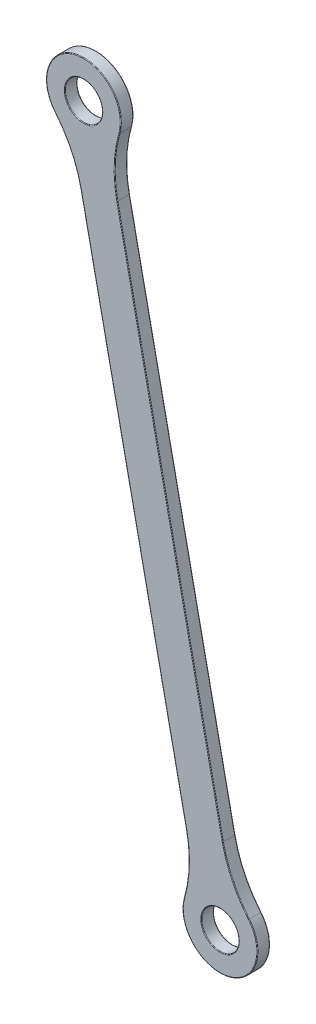
ISO-10303-21;
HEADER;
FILE_DESCRIPTION(('STEP AP214'),'2;1');
FILE_NAME('part.step','',(''),(''),'','','');
FILE_SCHEMA(('AUTOMOTIVE_DESIGN { 1 0 10303 214 1 1 1 1 }'));
ENDSEC;
DATA;
#1=APPLICATION_CONTEXT('core data for automotive mechanical design processes');
#2=APPLICATION_PROTOCOL_DEFINITION('international standard','automotive_design',2000,#1);
#3=PRODUCT_CONTEXT('',#1,'mechanical');
#4=PRODUCT('Part','Part','',(#3));
#5=PRODUCT_RELATED_PRODUCT_CATEGORY('part','',(#4));
#6=PRODUCT_DEFINITION_FORMATION('','',#4);
#7=PRODUCT_DEFINITION_CONTEXT('part definition',#1,'design');
#8=PRODUCT_DEFINITION('design','',#6,#7);
#9=PRODUCT_DEFINITION_SHAPE('','',#8);
#10=(LENGTH_UNIT() NAMED_UNIT(*) SI_UNIT(.MILLI.,.METRE.));
#11=(NAMED_UNIT(*) PLANE_ANGLE_UNIT() SI_UNIT($,.RADIAN.));
#12=(NAMED_UNIT(*) SI_UNIT($,.STERADIAN.) SOLID_ANGLE_UNIT());
#13=UNCERTAINTY_MEASURE_WITH_UNIT(LENGTH_MEASURE(1.E-05),#10,'distance_accuracy_value','');
#14=(GEOMETRIC_REPRESENTATION_CONTEXT(3) GLOBAL_UNCERTAINTY_ASSIGNED_CONTEXT((#13)) GLOBAL_UNIT_ASSIGNED_CONTEXT((#10,
#11,#12)) REPRESENTATION_CONTEXT('',''));
#15=CARTESIAN_POINT('',(0.,0.,0.));
#16=DIRECTION('',(0.,0.,1.));
#17=DIRECTION('',(1.,0.,0.));
#18=AXIS2_PLACEMENT_3D('',#15,#16,#17);
#19=CARTESIAN_POINT('',(-2.48269565790066,232.925265712231,3.));
#20=DIRECTION('',(0.,0.,-1.));
#21=DIRECTION('',(-1.,0.,0.));
#22=AXIS2_PLACEMENT_3D('',#19,#20,#21);
#23=CYLINDRICAL_SURFACE('',#22,9.00000000000004);
#24=DIRECTION('',(0.,0.,-1.));
#25=VECTOR('',#24,1.);
#26=CARTESIAN_POINT('',(6.17166336378079,230.455028896895,3.));
#27=LINE('',#26,#25);
#28=CARTESIAN_POINT('',(6.17166336378079,230.455028896895,2.85));
#29=VERTEX_POINT('',#28);
#30=CARTESIAN_POINT('',(6.17166336378079,230.455028896895,0.15));
#31=VERTEX_POINT('',#30);
#32=EDGE_CURVE('E304',#29,#31,#27,.T.);
#33=ORIENTED_EDGE('',*,*,#32,.T.);
#34=CARTESIAN_POINT('',(-2.48269565790066,232.925265712231,0.15));
#35=DIRECTION('',(0.,0.,1.));
#36=DIRECTION('',(1.,0.,0.));
#37=AXIS2_PLACEMENT_3D('',#34,#35,#36);
#38=CIRCLE('',#37,9.00000000000004);
#39=CARTESIAN_POINT('',(-9.41119641575365,227.181061916366,0.15));
#40=VERTEX_POINT('',#39);
#41=EDGE_CURVE('E220',#31,#40,#38,.T.);
#42=ORIENTED_EDGE('',*,*,#41,.T.);
#43=DIRECTION('',(0.,0.,-1.));
#44=VECTOR('',#43,1.);
#45=CARTESIAN_POINT('',(-9.41119641575365,227.181061916366,3.));
#46=LINE('',#45,#44);
#47=CARTESIAN_POINT('',(-9.41119641575365,227.181061916366,2.85));
#48=VERTEX_POINT('',#47);
#49=EDGE_CURVE('E261',#40,#48,#46,.F.);
#50=ORIENTED_EDGE('',*,*,#49,.T.);
#51=CARTESIAN_POINT('',(-2.48269565790066,232.925265712231,2.85));
#52=DIRECTION('',(0.,0.,1.));
#53=DIRECTION('',(1.,0.,0.));
#54=AXIS2_PLACEMENT_3D('',#51,#52,#53);
#55=CIRCLE('',#54,9.00000000000004);
#56=EDGE_CURVE('E218',#48,#29,#55,.F.);
#57=ORIENTED_EDGE('',*,*,#56,.T.);
#58=EDGE_LOOP('',(#33,#42,#50,#57));
#59=FACE_BOUND('',#58,.T.);
#60=ADVANCED_FACE('F34',(#59),#23,.T.);
#61=CARTESIAN_POINT('',(40.0872368361502,8.42234940178125,3.));
#62=DIRECTION('',(0.978633705961097,0.205611452883465,0.));
#63=DIRECTION('',(-0.205611452883465,0.978633705961097,0.));
#64=AXIS2_PLACEMENT_3D('',#61,#62,#63);
#65=PLANE('',#64);
#66=DIRECTION('',(0.,0.,1.));
#67=VECTOR('',#66,1.);
#68=CARTESIAN_POINT('',(-3.14718776309727,214.202059516653,0.));
#69=LINE('',#68,#67);
#70=CARTESIAN_POINT('',(-3.14718776309727,214.202059516653,2.85));
#71=VERTEX_POINT('',#70);
#72=CARTESIAN_POINT('',(-3.14718776309727,214.202059516653,0.15));
#73=VERTEX_POINT('',#72);
#74=EDGE_CURVE('E300',#71,#73,#69,.F.);
#75=ORIENTED_EDGE('',*,*,#74,.T.);
#76=DIRECTION('',(0.205611452883465,-0.978633705961097,0.));
#77=VECTOR('',#76,1.);
#78=CARTESIAN_POINT('',(40.0872368361502,8.42234940178125,0.15));
#79=LINE('',#78,#77);
#80=CARTESIAN_POINT('',(22.2719255550006,93.2165758780827,0.15));
#81=VERTEX_POINT('',#80);
#82=EDGE_CURVE('E195',#73,#81,#79,.T.);
#83=ORIENTED_EDGE('',*,*,#82,.T.);
#84=DIRECTION('',(0.,0.,1.));
#85=VECTOR('',#84,1.);
#86=CARTESIAN_POINT('',(22.2719255550006,93.2165758780827,3.));
#87=LINE('',#86,#85);
#88=CARTESIAN_POINT('',(22.2719255550006,93.2165758780827,2.85));
#89=VERTEX_POINT('',#88);
#90=EDGE_CURVE('E314',#81,#89,#87,.T.);
#91=ORIENTED_EDGE('',*,*,#90,.T.);
#92=DIRECTION('',(0.205611452883465,-0.978633705961097,0.));
#93=VECTOR('',#92,1.);
#94=CARTESIAN_POINT('',(-3.14718776309731,214.202059516653,2.85));
#95=LINE('',#94,#93);
#96=EDGE_CURVE('E193',#89,#71,#95,.F.);
#97=ORIENTED_EDGE('',*,*,#96,.T.);
#98=EDGE_LOOP('',(#75,#83,#91,#97));
#99=FACE_BOUND('',#98,.T.);
#100=ADVANCED_FACE('F344',(#99),#65,.F.);
#101=CARTESIAN_POINT('',(30.4151368034538,76.3438727584557,3.));
#102=DIRECTION('',(0.,0.,-1.));
#103=DIRECTION('',(-1.,0.,0.));
#104=AXIS2_PLACEMENT_3D('',#101,#102,#103);
#105=CYLINDRICAL_SURFACE('',#104,9.00000000000004);
#106=DIRECTION('',(0.,0.,-1.));
#107=VECTOR('',#106,1.);
#108=CARTESIAN_POINT('',(21.7607777817724,78.8141095737918,3.));
#109=LINE('',#108,#107);
#110=CARTESIAN_POINT('',(21.7607777817724,78.8141095737918,2.85));
#111=VERTEX_POINT('',#110);
#112=CARTESIAN_POINT('',(21.7607777817724,78.8141095737918,0.15));
#113=VERTEX_POINT('',#112);
#114=EDGE_CURVE('E321',#111,#113,#109,.T.);
#115=ORIENTED_EDGE('',*,*,#114,.T.);
#116=CARTESIAN_POINT('',(30.4151368034538,76.3438727584557,0.15));
#117=DIRECTION('',(0.,0.,1.));
#118=DIRECTION('',(1.,0.,0.));
#119=AXIS2_PLACEMENT_3D('',#116,#117,#118);
#120=CIRCLE('',#119,9.00000000000004);
#121=CARTESIAN_POINT('',(37.3436375613068,82.0880765543208,0.15));
#122=VERTEX_POINT('',#121);
#123=EDGE_CURVE('E203',#113,#122,#120,.T.);
#124=ORIENTED_EDGE('',*,*,#123,.T.);
#125=DIRECTION('',(0.,0.,-1.));
#126=VECTOR('',#125,1.);
#127=CARTESIAN_POINT('',(37.3436375613068,82.0880765543208,3.));
#128=LINE('',#127,#126);
#129=CARTESIAN_POINT('',(37.3436375613068,82.0880765543208,2.85));
#130=VERTEX_POINT('',#129);
#131=EDGE_CURVE('E318',#122,#130,#128,.F.);
#132=ORIENTED_EDGE('',*,*,#131,.T.);
#133=CARTESIAN_POINT('',(30.4151368034538,76.3438727584557,2.85));
#134=DIRECTION('',(0.,0.,1.));
#135=DIRECTION('',(1.,0.,0.));
#136=AXIS2_PLACEMENT_3D('',#133,#134,#135);
#137=CIRCLE('',#136,9.00000000000004);
#138=EDGE_CURVE('E201',#130,#111,#137,.F.);
#139=ORIENTED_EDGE('',*,*,#138,.T.);
#140=EDGE_LOOP('',(#115,#124,#132,#139));
#141=FACE_BOUND('',#140,.T.);
#142=ADVANCED_FACE('F389',(#141),#105,.T.);
#143=CARTESIAN_POINT('',(48.8949401898,10.2728524777324,3.));
#144=DIRECTION('',(0.978633705961097,0.205611452883465,0.));
#145=DIRECTION('',(-0.205611452883465,0.978633705961097,0.));
#146=AXIS2_PLACEMENT_3D('',#143,#144,#145);
#147=PLANE('',#146);
#148=DIRECTION('',(0.,0.,-1.));
#149=VECTOR('',#148,1.);
#150=CARTESIAN_POINT('',(31.0796289086504,95.0670789540339,3.));
#151=LINE('',#150,#149);
#152=CARTESIAN_POINT('',(31.0796289086504,95.0670789540339,2.85));
#153=VERTEX_POINT('',#152);
#154=CARTESIAN_POINT('',(31.0796289086504,95.0670789540339,0.15));
#155=VERTEX_POINT('',#154);
#156=EDGE_CURVE('E306',#153,#155,#151,.T.);
#157=ORIENTED_EDGE('',*,*,#156,.T.);
#158=DIRECTION('',(0.205611452883465,-0.978633705961097,0.));
#159=VECTOR('',#158,1.);
#160=CARTESIAN_POINT('',(5.66051559055251,216.052562592604,0.15));
#161=LINE('',#160,#159);
#162=CARTESIAN_POINT('',(5.66051559055255,216.052562592604,0.15));
#163=VERTEX_POINT('',#162);
#164=EDGE_CURVE('E212',#155,#163,#161,.F.);
#165=ORIENTED_EDGE('',*,*,#164,.T.);
#166=DIRECTION('',(0.,0.,-1.));
#167=VECTOR('',#166,1.);
#168=CARTESIAN_POINT('',(5.66051559055255,216.052562592604,3.));
#169=LINE('',#168,#167);
#170=CARTESIAN_POINT('',(5.66051559055255,216.052562592604,2.85));
#171=VERTEX_POINT('',#170);
#172=EDGE_CURVE('E311',#163,#171,#169,.F.);
#173=ORIENTED_EDGE('',*,*,#172,.T.);
#174=DIRECTION('',(0.205611452883465,-0.978633705961097,0.));
#175=VECTOR('',#174,1.);
#176=CARTESIAN_POINT('',(48.8949401898,10.2728524777324,2.85));
#177=LINE('',#176,#175);
#178=EDGE_CURVE('E210',#171,#153,#177,.T.);
#179=ORIENTED_EDGE('',*,*,#178,.T.);
#180=EDGE_LOOP('',(#157,#165,#173,#179));
#181=FACE_BOUND('',#180,.T.);
#182=ADVANCED_FACE('F373',(#181),#147,.T.);
#183=CARTESIAN_POINT('',(30.4151368034538,76.3438727584557,3.));
#184=DIRECTION('',(0.,0.,-1.));
#185=DIRECTION('',(-1.,0.,0.));
#186=AXIS2_PLACEMENT_3D('',#183,#184,#185);
#187=CYLINDRICAL_SURFACE('',#186,4.49999999999997);
#188=CARTESIAN_POINT('',(30.4151368034538,76.3438727584557,0.15));
#189=DIRECTION('',(0.,0.,1.));
#190=DIRECTION('',(1.,0.,0.));
#191=AXIS2_PLACEMENT_3D('',#188,#189,#190);
#192=CIRCLE('',#191,4.49999999999997);
#193=CARTESIAN_POINT('',(34.9151368034538,76.3438727584557,0.15));
#194=VERTEX_POINT('',#193);
#195=EDGE_CURVE('E225',#194,#194,#192,.F.);
#196=ORIENTED_EDGE('',*,*,#195,.T.);
#197=EDGE_LOOP('',(#196));
#198=FACE_BOUND('',#197,.T.);
#199=CARTESIAN_POINT('',(30.4151368034538,76.3438727584557,2.85));
#200=DIRECTION('',(0.,0.,1.));
#201=DIRECTION('',(1.,0.,0.));
#202=AXIS2_PLACEMENT_3D('',#199,#200,#201);
#203=CIRCLE('',#202,4.49999999999997);
#204=CARTESIAN_POINT('',(34.9151368034538,76.3438727584557,2.85));
#205=VERTEX_POINT('',#204);
#206=EDGE_CURVE('E222',#205,#205,#203,.T.);
#207=ORIENTED_EDGE('',*,*,#206,.T.);
#208=EDGE_LOOP('',(#207));
#209=FACE_BOUND('',#208,.T.);
#210=ADVANCED_FACE('F396',(#198,#209),#187,.F.);
#211=CARTESIAN_POINT('',(-2.48269565790066,232.925265712231,3.));
#212=DIRECTION('',(0.,0.,-1.));
#213=DIRECTION('',(-1.,0.,0.));
#214=AXIS2_PLACEMENT_3D('',#211,#212,#213);
#215=CYLINDRICAL_SURFACE('',#214,4.49999999999997);
#216=CARTESIAN_POINT('',(-2.48269565790066,232.925265712231,0.15));
#217=DIRECTION('',(0.,0.,1.));
#218=DIRECTION('',(1.,0.,0.));
#219=AXIS2_PLACEMENT_3D('',#216,#217,#218);
#220=CIRCLE('',#219,4.49999999999997);
#221=CARTESIAN_POINT('',(2.01730434209931,232.925265712231,0.15));
#222=VERTEX_POINT('',#221);
#223=EDGE_CURVE('E187',#222,#222,#220,.F.);
#224=ORIENTED_EDGE('',*,*,#223,.T.);
#225=EDGE_LOOP('',(#224));
#226=FACE_BOUND('',#225,.T.);
#227=CARTESIAN_POINT('',(-2.48269565790066,232.925265712231,2.85));
#228=DIRECTION('',(0.,0.,1.));
#229=DIRECTION('',(1.,0.,0.));
#230=AXIS2_PLACEMENT_3D('',#227,#228,#229);
#231=CIRCLE('',#230,4.49999999999997);
#232=CARTESIAN_POINT('',(2.01730434209931,232.925265712231,2.85));
#233=VERTEX_POINT('',#232);
#234=EDGE_CURVE('E179',#233,#233,#231,.T.);
#235=ORIENTED_EDGE('',*,*,#234,.T.);
#236=EDGE_LOOP('',(#235));
#237=FACE_BOUND('',#236,.T.);
#238=ADVANCED_FACE('F406',(#226,#237),#215,.F.);
#239=CARTESIAN_POINT('',(0.,0.,3.));
#240=DIRECTION('',(0.,0.,1.));
#241=DIRECTION('',(1.,0.,0.));
#242=AXIS2_PLACEMENT_3D('',#239,#240,#241);
#243=PLANE('',#242);
#244=CARTESIAN_POINT('',(-2.48269565790066,232.925265712231,3.));
#245=DIRECTION('',(0.,0.,1.));
#246=DIRECTION('',(1.,0.,0.));
#247=AXIS2_PLACEMENT_3D('',#244,#245,#246);
#248=CIRCLE('',#247,4.64999999999997);
#249=CARTESIAN_POINT('',(2.16730434209931,232.925265712231,3.));
#250=VERTEX_POINT('',#249);
#251=EDGE_CURVE('E11',#250,#250,#248,.F.);
#252=ORIENTED_EDGE('',*,*,#251,.T.);
#253=EDGE_LOOP('',(#252));
#254=FACE_BOUND('',#253,.T.);
#255=CARTESIAN_POINT('',(30.4151368034538,76.3438727584557,3.));
#256=DIRECTION('',(0.,0.,1.));
#257=DIRECTION('',(1.,0.,0.));
#258=AXIS2_PLACEMENT_3D('',#255,#256,#257);
#259=CIRCLE('',#258,8.85000000000004);
#260=CARTESIAN_POINT('',(21.9050170988004,78.7729389602028,3.));
#261=VERTEX_POINT('',#260);
#262=CARTESIAN_POINT('',(37.2281625486759,81.9923398243897,3.));
#263=VERTEX_POINT('',#262);
#264=EDGE_CURVE('E51',#261,#263,#259,.T.);
#265=ORIENTED_EDGE('',*,*,#264,.T.);
#266=CARTESIAN_POINT('',(60.4386400874833,101.235422540538,3.));
#267=DIRECTION('',(0.,0.,1.));
#268=DIRECTION('',(1.,0.,0.));
#269=AXIS2_PLACEMENT_3D('',#266,#267,#268);
#270=CIRCLE('',#269,30.15);
#271=CARTESIAN_POINT('',(30.9328338527562,95.0362372361014,3.));
#272=VERTEX_POINT('',#271);
#273=EDGE_CURVE('E43',#263,#272,#270,.F.);
#274=ORIENTED_EDGE('',*,*,#273,.T.);
#275=DIRECTION('',(0.205611452883465,-0.978633705961097,0.));
#276=VECTOR('',#275,1.);
#277=CARTESIAN_POINT('',(48.7481451339058,10.2420107597999,3.));
#278=LINE('',#277,#276);
#279=CARTESIAN_POINT('',(5.51372053465839,216.021720874672,3.));
#280=VERTEX_POINT('',#279);
#281=EDGE_CURVE('E231',#272,#280,#278,.F.);
#282=ORIENTED_EDGE('',*,*,#281,.T.);
#283=CARTESIAN_POINT('',(35.0195267693854,222.220906179108,3.));
#284=DIRECTION('',(0.,0.,1.));
#285=DIRECTION('',(1.,0.,0.));
#286=AXIS2_PLACEMENT_3D('',#283,#284,#285);
#287=CIRCLE('',#286,30.15);
#288=CARTESIAN_POINT('',(6.02742404675276,230.496199510484,3.));
#289=VERTEX_POINT('',#288);
#290=EDGE_CURVE('E233',#280,#289,#287,.F.);
#291=ORIENTED_EDGE('',*,*,#290,.T.);
#292=CARTESIAN_POINT('',(-2.48269565790066,232.925265712231,3.));
#293=DIRECTION('',(0.,0.,1.));
#294=DIRECTION('',(1.,0.,0.));
#295=AXIS2_PLACEMENT_3D('',#292,#293,#294);
#296=CIRCLE('',#295,8.85000000000004);
#297=CARTESIAN_POINT('',(-9.29572140312275,227.276798646297,3.));
#298=VERTEX_POINT('',#297);
#299=EDGE_CURVE('E235',#289,#298,#296,.T.);
#300=ORIENTED_EDGE('',*,*,#299,.T.);
#301=CARTESIAN_POINT('',(-32.5061989419302,208.033715930149,3.));
#302=DIRECTION('',(0.,0.,1.));
#303=DIRECTION('',(1.,0.,0.));
#304=AXIS2_PLACEMENT_3D('',#301,#302,#303);
#305=CIRCLE('',#304,30.15);
#306=CARTESIAN_POINT('',(-3.0003927072031,214.232901234586,3.));
#307=VERTEX_POINT('',#306);
#308=EDGE_CURVE('E237',#298,#307,#305,.F.);
#309=ORIENTED_EDGE('',*,*,#308,.T.);
#310=DIRECTION('',(0.205611452883465,-0.978633705961097,0.));
#311=VECTOR('',#310,1.);
#312=CARTESIAN_POINT('',(22.4187206108947,93.2474175960152,3.));
#313=LINE('',#312,#311);
#314=CARTESIAN_POINT('',(22.4187206108948,93.2474175960152,3.));
#315=VERTEX_POINT('',#314);
#316=EDGE_CURVE('E239',#307,#315,#313,.T.);
#317=ORIENTED_EDGE('',*,*,#316,.T.);
#318=CARTESIAN_POINT('',(-7.0870856238323,87.0482322915787,3.));
#319=DIRECTION('',(0.,0.,1.));
#320=DIRECTION('',(1.,0.,0.));
#321=AXIS2_PLACEMENT_3D('',#318,#319,#320);
#322=CIRCLE('',#321,30.15);
#323=EDGE_CURVE('E56',#315,#261,#322,.F.);
#324=ORIENTED_EDGE('',*,*,#323,.T.);
#325=EDGE_LOOP('',(#265,#274,#282,#291,#300,#309,#317,#324));
#326=FACE_BOUND('',#325,.T.);
#327=CARTESIAN_POINT('',(30.4151368034538,76.3438727584557,3.));
#328=DIRECTION('',(0.,0.,1.));
#329=DIRECTION('',(1.,0.,0.));
#330=AXIS2_PLACEMENT_3D('',#327,#328,#329);
#331=CIRCLE('',#330,4.64999999999997);
#332=CARTESIAN_POINT('',(35.0651368034538,76.3438727584557,3.));
#333=VERTEX_POINT('',#332);
#334=EDGE_CURVE('E228',#333,#333,#331,.F.);
#335=ORIENTED_EDGE('',*,*,#334,.T.);
#336=EDGE_LOOP('',(#335));
#337=FACE_BOUND('',#336,.T.);
#338=ADVANCED_FACE('F360',(#254,#326,#337),#243,.T.);
#339=CARTESIAN_POINT('',(0.,0.,0.));
#340=DIRECTION('',(0.,0.,1.));
#341=DIRECTION('',(1.,0.,0.));
#342=AXIS2_PLACEMENT_3D('',#339,#340,#341);
#343=PLANE('',#342);
#344=CARTESIAN_POINT('',(-2.48269565790066,232.925265712231,0.));
#345=DIRECTION('',(0.,0.,1.));
#346=DIRECTION('',(1.,0.,0.));
#347=AXIS2_PLACEMENT_3D('',#344,#345,#346);
#348=CIRCLE('',#347,4.64999999999997);
#349=CARTESIAN_POINT('',(2.16730434209931,232.925265712231,0.));
#350=VERTEX_POINT('',#349);
#351=EDGE_CURVE('E176',#350,#350,#348,.T.);
#352=ORIENTED_EDGE('',*,*,#351,.T.);
#353=EDGE_LOOP('',(#352));
#354=FACE_BOUND('',#353,.T.);
#355=DIRECTION('',(0.205611452883465,-0.978633705961097,0.));
#356=VECTOR('',#355,1.);
#357=CARTESIAN_POINT('',(40.2340318920443,8.45319111971376,0.));
#358=LINE('',#357,#356);
#359=CARTESIAN_POINT('',(22.4187206108948,93.2474175960152,0.));
#360=VERTEX_POINT('',#359);
#361=CARTESIAN_POINT('',(-3.00039270720311,214.232901234586,0.));
#362=VERTEX_POINT('',#361);
#363=EDGE_CURVE('E174',#360,#362,#358,.F.);
#364=ORIENTED_EDGE('',*,*,#363,.T.);
#365=CARTESIAN_POINT('',(-32.5061989419302,208.033715930149,0.));
#366=DIRECTION('',(0.,0.,1.));
#367=DIRECTION('',(1.,0.,0.));
#368=AXIS2_PLACEMENT_3D('',#365,#366,#367);
#369=CIRCLE('',#368,30.15);
#370=CARTESIAN_POINT('',(-9.29572140312275,227.276798646297,0.));
#371=VERTEX_POINT('',#370);
#372=EDGE_CURVE('E154',#362,#371,#369,.T.);
#373=ORIENTED_EDGE('',*,*,#372,.T.);
#374=CARTESIAN_POINT('',(-2.48269565790066,232.925265712231,0.));
#375=DIRECTION('',(0.,0.,1.));
#376=DIRECTION('',(1.,0.,0.));
#377=AXIS2_PLACEMENT_3D('',#374,#375,#376);
#378=CIRCLE('',#377,8.85000000000004);
#379=CARTESIAN_POINT('',(6.02742404675276,230.496199510484,0.));
#380=VERTEX_POINT('',#379);
#381=EDGE_CURVE('E162',#371,#380,#378,.F.);
#382=ORIENTED_EDGE('',*,*,#381,.T.);
#383=CARTESIAN_POINT('',(35.0195267693854,222.220906179108,0.));
#384=DIRECTION('',(0.,0.,1.));
#385=DIRECTION('',(1.,0.,0.));
#386=AXIS2_PLACEMENT_3D('',#383,#384,#385);
#387=CIRCLE('',#386,30.15);
#388=CARTESIAN_POINT('',(5.51372053465837,216.021720874672,0.));
#389=VERTEX_POINT('',#388);
#390=EDGE_CURVE('E168',#380,#389,#387,.T.);
#391=ORIENTED_EDGE('',*,*,#390,.T.);
#392=DIRECTION('',(0.205611452883465,-0.978633705961097,0.));
#393=VECTOR('',#392,1.);
#394=CARTESIAN_POINT('',(30.9328338527562,95.0362372361014,0.));
#395=LINE('',#394,#393);
#396=CARTESIAN_POINT('',(30.9328338527562,95.0362372361014,0.));
#397=VERTEX_POINT('',#396);
#398=EDGE_CURVE('E327',#389,#397,#395,.T.);
#399=ORIENTED_EDGE('',*,*,#398,.T.);
#400=CARTESIAN_POINT('',(60.4386400874833,101.235422540538,0.));
#401=DIRECTION('',(0.,0.,1.));
#402=DIRECTION('',(1.,0.,0.));
#403=AXIS2_PLACEMENT_3D('',#400,#401,#402);
#404=CIRCLE('',#403,30.15);
#405=CARTESIAN_POINT('',(37.2281625486759,81.9923398243897,0.));
#406=VERTEX_POINT('',#405);
#407=EDGE_CURVE('E329',#397,#406,#404,.T.);
#408=ORIENTED_EDGE('',*,*,#407,.T.);
#409=CARTESIAN_POINT('',(30.4151368034538,76.3438727584557,0.));
#410=DIRECTION('',(0.,0.,1.));
#411=DIRECTION('',(1.,0.,0.));
#412=AXIS2_PLACEMENT_3D('',#409,#410,#411);
#413=CIRCLE('',#412,8.85000000000004);
#414=CARTESIAN_POINT('',(21.9050170988004,78.7729389602028,0.));
#415=VERTEX_POINT('',#414);
#416=EDGE_CURVE('E331',#406,#415,#413,.F.);
#417=ORIENTED_EDGE('',*,*,#416,.T.);
#418=CARTESIAN_POINT('',(-7.0870856238323,87.0482322915787,0.));
#419=DIRECTION('',(0.,0.,1.));
#420=DIRECTION('',(1.,0.,0.));
#421=AXIS2_PLACEMENT_3D('',#418,#419,#420);
#422=CIRCLE('',#421,30.15);
#423=EDGE_CURVE('E181',#415,#360,#422,.T.);
#424=ORIENTED_EDGE('',*,*,#423,.T.);
#425=EDGE_LOOP('',(#364,#373,#382,#391,#399,#408,#417,#424));
#426=FACE_BOUND('',#425,.T.);
#427=CARTESIAN_POINT('',(30.4151368034538,76.3438727584557,0.));
#428=DIRECTION('',(0.,0.,1.));
#429=DIRECTION('',(1.,0.,0.));
#430=AXIS2_PLACEMENT_3D('',#427,#428,#429);
#431=CIRCLE('',#430,4.64999999999997);
#432=CARTESIAN_POINT('',(35.0651368034538,76.3438727584557,0.));
#433=VERTEX_POINT('',#432);
#434=EDGE_CURVE('E169',#433,#433,#431,.T.);
#435=ORIENTED_EDGE('',*,*,#434,.T.);
#436=EDGE_LOOP('',(#435));
#437=FACE_BOUND('',#436,.T.);
#438=ADVANCED_FACE('F171',(#354,#426,#437),#343,.F.);
#439=CARTESIAN_POINT('',(35.0195267693854,222.220906179108,3.));
#440=DIRECTION('',(0.,0.,-1.));
#441=DIRECTION('',(-1.,0.,0.));
#442=AXIS2_PLACEMENT_3D('',#439,#440,#441);
#443=CYLINDRICAL_SURFACE('',#442,30.);
#444=ORIENTED_EDGE('',*,*,#172,.F.);
#445=CARTESIAN_POINT('',(35.0195267693854,222.220906179108,0.15));
#446=DIRECTION('',(0.,0.,1.));
#447=DIRECTION('',(1.,0.,0.));
#448=AXIS2_PLACEMENT_3D('',#445,#446,#447);
#449=CIRCLE('',#448,30.);
#450=EDGE_CURVE('E216',#163,#31,#449,.F.);
#451=ORIENTED_EDGE('',*,*,#450,.T.);
#452=ORIENTED_EDGE('',*,*,#32,.F.);
#453=CARTESIAN_POINT('',(35.0195267693854,222.220906179108,2.85));
#454=DIRECTION('',(0.,0.,1.));
#455=DIRECTION('',(1.,0.,0.));
#456=AXIS2_PLACEMENT_3D('',#453,#454,#455);
#457=CIRCLE('',#456,30.);
#458=EDGE_CURVE('E214',#29,#171,#457,.T.);
#459=ORIENTED_EDGE('',*,*,#458,.T.);
#460=EDGE_LOOP('',(#444,#451,#452,#459));
#461=FACE_BOUND('',#460,.T.);
#462=ADVANCED_FACE('F408',(#461),#443,.F.);
#463=CARTESIAN_POINT('',(-32.5061989419302,208.033715930149,3.));
#464=DIRECTION('',(0.,0.,-1.));
#465=DIRECTION('',(-1.,0.,0.));
#466=AXIS2_PLACEMENT_3D('',#463,#464,#465);
#467=CYLINDRICAL_SURFACE('',#466,30.);
#468=ORIENTED_EDGE('',*,*,#49,.F.);
#469=CARTESIAN_POINT('',(-32.5061989419302,208.033715930149,0.15));
#470=DIRECTION('',(0.,0.,1.));
#471=DIRECTION('',(1.,0.,0.));
#472=AXIS2_PLACEMENT_3D('',#469,#470,#471);
#473=CIRCLE('',#472,30.);
#474=EDGE_CURVE('E156',#40,#73,#473,.F.);
#475=ORIENTED_EDGE('',*,*,#474,.T.);
#476=ORIENTED_EDGE('',*,*,#74,.F.);
#477=CARTESIAN_POINT('',(-32.5061989419302,208.033715930149,2.85));
#478=DIRECTION('',(0.,0.,1.));
#479=DIRECTION('',(1.,0.,0.));
#480=AXIS2_PLACEMENT_3D('',#477,#478,#479);
#481=CIRCLE('',#480,30.);
#482=EDGE_CURVE('E190',#71,#48,#481,.T.);
#483=ORIENTED_EDGE('',*,*,#482,.T.);
#484=EDGE_LOOP('',(#468,#475,#476,#483));
#485=FACE_BOUND('',#484,.T.);
#486=ADVANCED_FACE('F298',(#485),#467,.F.);
#487=CARTESIAN_POINT('',(-7.0870856238323,87.0482322915787,3.));
#488=DIRECTION('',(0.,0.,-1.));
#489=DIRECTION('',(-1.,0.,0.));
#490=AXIS2_PLACEMENT_3D('',#487,#488,#489);
#491=CYLINDRICAL_SURFACE('',#490,30.);
#492=ORIENTED_EDGE('',*,*,#90,.F.);
#493=CARTESIAN_POINT('',(-7.0870856238323,87.0482322915787,0.15));
#494=DIRECTION('',(0.,0.,1.));
#495=DIRECTION('',(1.,0.,0.));
#496=AXIS2_PLACEMENT_3D('',#493,#494,#495);
#497=CIRCLE('',#496,30.);
#498=EDGE_CURVE('E199',#81,#113,#497,.F.);
#499=ORIENTED_EDGE('',*,*,#498,.T.);
#500=ORIENTED_EDGE('',*,*,#114,.F.);
#501=CARTESIAN_POINT('',(-7.0870856238323,87.0482322915787,2.85));
#502=DIRECTION('',(0.,0.,1.));
#503=DIRECTION('',(1.,0.,0.));
#504=AXIS2_PLACEMENT_3D('',#501,#502,#503);
#505=CIRCLE('',#504,30.);
#506=EDGE_CURVE('E197',#111,#89,#505,.T.);
#507=ORIENTED_EDGE('',*,*,#506,.T.);
#508=EDGE_LOOP('',(#492,#499,#500,#507));
#509=FACE_BOUND('',#508,.T.);
#510=ADVANCED_FACE('F346',(#509),#491,.F.);
#511=CARTESIAN_POINT('',(60.4386400874833,101.235422540538,3.));
#512=DIRECTION('',(0.,0.,-1.));
#513=DIRECTION('',(-1.,0.,0.));
#514=AXIS2_PLACEMENT_3D('',#511,#512,#513);
#515=CYLINDRICAL_SURFACE('',#514,30.);
#516=ORIENTED_EDGE('',*,*,#131,.F.);
#517=CARTESIAN_POINT('',(60.4386400874833,101.235422540538,0.15));
#518=DIRECTION('',(0.,0.,1.));
#519=DIRECTION('',(1.,0.,0.));
#520=AXIS2_PLACEMENT_3D('',#517,#518,#519);
#521=CIRCLE('',#520,30.);
#522=EDGE_CURVE('E208',#122,#155,#521,.F.);
#523=ORIENTED_EDGE('',*,*,#522,.T.);
#524=ORIENTED_EDGE('',*,*,#156,.F.);
#525=CARTESIAN_POINT('',(60.4386400874833,101.235422540538,2.85));
#526=DIRECTION('',(0.,0.,1.));
#527=DIRECTION('',(1.,0.,0.));
#528=AXIS2_PLACEMENT_3D('',#525,#526,#527);
#529=CIRCLE('',#528,30.);
#530=EDGE_CURVE('E205',#153,#130,#529,.T.);
#531=ORIENTED_EDGE('',*,*,#530,.T.);
#532=EDGE_LOOP('',(#516,#523,#524,#531));
#533=FACE_BOUND('',#532,.T.);
#534=ADVANCED_FACE('F378',(#533),#515,.F.);
#535=CARTESIAN_POINT('',(-2.48269565790066,232.925265712231,0.15));
#536=DIRECTION('',(0.,0.,1.));
#537=DIRECTION('',(1.,0.,0.));
#538=AXIS2_PLACEMENT_3D('',#535,#536,#537);
#539=TOROIDAL_SURFACE('',#538,4.64999999999997,0.15);
#540=ORIENTED_EDGE('',*,*,#223,.F.);
#541=EDGE_LOOP('',(#540));
#542=FACE_BOUND('',#541,.T.);
#543=ORIENTED_EDGE('',*,*,#351,.F.);
#544=EDGE_LOOP('',(#543));
#545=FACE_BOUND('',#544,.T.);
#546=ADVANCED_FACE('F418',(#542,#545),#539,.T.);
#547=CARTESIAN_POINT('',(60.4386400874833,101.235422540538,0.15));
#548=DIRECTION('',(0.,0.,1.));
#549=DIRECTION('',(1.,0.,0.));
#550=AXIS2_PLACEMENT_3D('',#547,#548,#549);
#551=TOROIDAL_SURFACE('',#550,30.15,0.15);
#552=CARTESIAN_POINT('',(30.9328338527562,95.0362372361014,0.15));
#553=DIRECTION('',(-0.205611452883482,0.978633705961093,0.));
#554=DIRECTION('',(-0.978633705961093,-0.205611452883482,0.));
#555=AXIS2_PLACEMENT_3D('',#552,#553,#554);
#556=CIRCLE('',#555,0.15);
#557=EDGE_CURVE('E255',#155,#397,#556,.T.);
#558=ORIENTED_EDGE('',*,*,#557,.F.);
#559=ORIENTED_EDGE('',*,*,#522,.F.);
#560=CARTESIAN_POINT('',(37.2281625486759,81.9923398243897,0.15));
#561=DIRECTION('',(0.638244866207251,-0.769833417539202,0.));
#562=DIRECTION('',(0.769833417539202,0.638244866207252,0.));
#563=AXIS2_PLACEMENT_3D('',#560,#561,#562);
#564=CIRCLE('',#563,0.15);
#565=EDGE_CURVE('E258',#406,#122,#564,.T.);
#566=ORIENTED_EDGE('',*,*,#565,.F.);
#567=ORIENTED_EDGE('',*,*,#407,.F.);
#568=EDGE_LOOP('',(#558,#559,#566,#567));
#569=FACE_BOUND('',#568,.T.);
#570=ADVANCED_FACE('F382',(#569),#551,.T.);
#571=CARTESIAN_POINT('',(30.4151368034538,76.3438727584557,0.15));
#572=DIRECTION('',(0.,0.,1.));
#573=DIRECTION('',(1.,0.,0.));
#574=AXIS2_PLACEMENT_3D('',#571,#572,#573);
#575=TOROIDAL_SURFACE('',#574,8.85000000000004,0.15);
#576=ORIENTED_EDGE('',*,*,#565,.T.);
#577=ORIENTED_EDGE('',*,*,#123,.F.);
#578=CARTESIAN_POINT('',(21.9050170988004,78.7729389602028,0.15));
#579=DIRECTION('',(0.274470757259572,0.961595446853487,0.));
#580=DIRECTION('',(-0.961595446853487,0.274470757259572,0.));
#581=AXIS2_PLACEMENT_3D('',#578,#579,#580);
#582=CIRCLE('',#581,0.15);
#583=EDGE_CURVE('E252',#415,#113,#582,.T.);
#584=ORIENTED_EDGE('',*,*,#583,.F.);
#585=ORIENTED_EDGE('',*,*,#416,.F.);
#586=EDGE_LOOP('',(#576,#577,#584,#585));
#587=FACE_BOUND('',#586,.T.);
#588=ADVANCED_FACE('F387',(#587),#575,.T.);
#589=CARTESIAN_POINT('',(48.7481451339058,10.2420107597999,0.15));
#590=DIRECTION('',(-0.205611452883465,0.978633705961097,0.));
#591=DIRECTION('',(-0.978633705961097,-0.205611452883465,0.));
#592=AXIS2_PLACEMENT_3D('',#589,#590,#591);
#593=CYLINDRICAL_SURFACE('',#592,0.15);
#594=ORIENTED_EDGE('',*,*,#557,.T.);
#595=ORIENTED_EDGE('',*,*,#398,.F.);
#596=CARTESIAN_POINT('',(5.51372053465839,216.021720874672,0.15));
#597=DIRECTION('',(-0.205611452883484,0.978633705961093,0.));
#598=DIRECTION('',(-0.978633705961093,-0.205611452883484,0.));
#599=AXIS2_PLACEMENT_3D('',#596,#597,#598);
#600=CIRCLE('',#599,0.15);
#601=EDGE_CURVE('E249',#163,#389,#600,.T.);
#602=ORIENTED_EDGE('',*,*,#601,.F.);
#603=ORIENTED_EDGE('',*,*,#164,.F.);
#604=EDGE_LOOP('',(#594,#595,#602,#603));
#605=FACE_BOUND('',#604,.T.);
#606=ADVANCED_FACE('F435',(#605),#593,.T.);
#607=CARTESIAN_POINT('',(-7.0870856238323,87.0482322915787,0.15));
#608=DIRECTION('',(0.,0.,1.));
#609=DIRECTION('',(1.,0.,0.));
#610=AXIS2_PLACEMENT_3D('',#607,#608,#609);
#611=TOROIDAL_SURFACE('',#610,30.15,0.15);
#612=ORIENTED_EDGE('',*,*,#583,.T.);
#613=ORIENTED_EDGE('',*,*,#498,.F.);
#614=CARTESIAN_POINT('',(22.4187206108948,93.2474175960152,0.15));
#615=DIRECTION('',(-0.205611452883486,0.978633705961092,0.));
#616=DIRECTION('',(-0.978633705961092,-0.205611452883486,0.));
#617=AXIS2_PLACEMENT_3D('',#614,#615,#616);
#618=CIRCLE('',#617,0.15);
#619=EDGE_CURVE('E246',#360,#81,#618,.T.);
#620=ORIENTED_EDGE('',*,*,#619,.F.);
#621=ORIENTED_EDGE('',*,*,#423,.F.);
#622=EDGE_LOOP('',(#612,#613,#620,#621));
#623=FACE_BOUND('',#622,.T.);
#624=ADVANCED_FACE('F338',(#623),#611,.T.);
#625=CARTESIAN_POINT('',(35.0195267693854,222.220906179108,0.15));
#626=DIRECTION('',(0.,0.,1.));
#627=DIRECTION('',(1.,0.,0.));
#628=AXIS2_PLACEMENT_3D('',#625,#626,#627);
#629=TOROIDAL_SURFACE('',#628,30.15,0.15);
#630=ORIENTED_EDGE('',*,*,#601,.T.);
#631=ORIENTED_EDGE('',*,*,#390,.F.);
#632=CARTESIAN_POINT('',(6.02742404675276,230.496199510484,0.15));
#633=DIRECTION('',(0.274470757259576,0.961595446853486,0.));
#634=DIRECTION('',(-0.961595446853486,0.274470757259576,0.));
#635=AXIS2_PLACEMENT_3D('',#632,#633,#634);
#636=CIRCLE('',#635,0.15);
#637=EDGE_CURVE('E165',#31,#380,#636,.T.);
#638=ORIENTED_EDGE('',*,*,#637,.F.);
#639=ORIENTED_EDGE('',*,*,#450,.F.);
#640=EDGE_LOOP('',(#630,#631,#638,#639));
#641=FACE_BOUND('',#640,.T.);
#642=ADVANCED_FACE('F429',(#641),#629,.T.);
#643=CARTESIAN_POINT('',(40.2340318920443,8.45319111971376,0.15));
#644=DIRECTION('',(0.205611452883465,-0.978633705961097,0.));
#645=DIRECTION('',(0.978633705961097,0.205611452883465,0.));
#646=AXIS2_PLACEMENT_3D('',#643,#644,#645);
#647=CYLINDRICAL_SURFACE('',#646,0.15);
#648=ORIENTED_EDGE('',*,*,#619,.T.);
#649=ORIENTED_EDGE('',*,*,#82,.F.);
#650=CARTESIAN_POINT('',(-3.00039270720311,214.232901234586,0.15));
#651=DIRECTION('',(-0.205611452883481,0.978633705961094,0.));
#652=DIRECTION('',(-0.978633705961094,-0.205611452883481,0.));
#653=AXIS2_PLACEMENT_3D('',#650,#651,#652);
#654=CIRCLE('',#653,0.15);
#655=EDGE_CURVE('E159',#362,#73,#654,.T.);
#656=ORIENTED_EDGE('',*,*,#655,.F.);
#657=ORIENTED_EDGE('',*,*,#363,.F.);
#658=EDGE_LOOP('',(#648,#649,#656,#657));
#659=FACE_BOUND('',#658,.T.);
#660=ADVANCED_FACE('F341',(#659),#647,.T.);
#661=CARTESIAN_POINT('',(-2.48269565790066,232.925265712231,0.15));
#662=DIRECTION('',(0.,0.,1.));
#663=DIRECTION('',(1.,0.,0.));
#664=AXIS2_PLACEMENT_3D('',#661,#662,#663);
#665=TOROIDAL_SURFACE('',#664,8.85000000000004,0.15);
#666=ORIENTED_EDGE('',*,*,#637,.T.);
#667=ORIENTED_EDGE('',*,*,#381,.F.);
#668=CARTESIAN_POINT('',(-9.29572140312276,227.276798646297,0.15));
#669=DIRECTION('',(0.638244866207185,-0.769833417539257,0.));
#670=DIRECTION('',(0.769833417539257,0.638244866207185,0.));
#671=AXIS2_PLACEMENT_3D('',#668,#669,#670);
#672=CIRCLE('',#671,0.15);
#673=EDGE_CURVE('E150',#40,#371,#672,.T.);
#674=ORIENTED_EDGE('',*,*,#673,.F.);
#675=ORIENTED_EDGE('',*,*,#41,.F.);
#676=EDGE_LOOP('',(#666,#667,#674,#675));
#677=FACE_BOUND('',#676,.T.);
#678=ADVANCED_FACE('F163',(#677),#665,.T.);
#679=CARTESIAN_POINT('',(-32.5061989419302,208.033715930149,0.15));
#680=DIRECTION('',(0.,0.,1.));
#681=DIRECTION('',(1.,0.,0.));
#682=AXIS2_PLACEMENT_3D('',#679,#680,#681);
#683=TOROIDAL_SURFACE('',#682,30.15,0.15);
#684=ORIENTED_EDGE('',*,*,#655,.T.);
#685=ORIENTED_EDGE('',*,*,#474,.F.);
#686=ORIENTED_EDGE('',*,*,#673,.T.);
#687=ORIENTED_EDGE('',*,*,#372,.F.);
#688=EDGE_LOOP('',(#684,#685,#686,#687));
#689=FACE_BOUND('',#688,.T.);
#690=ADVANCED_FACE('F152',(#689),#683,.T.);
#691=CARTESIAN_POINT('',(30.4151368034538,76.3438727584557,0.15));
#692=DIRECTION('',(0.,0.,1.));
#693=DIRECTION('',(1.,0.,0.));
#694=AXIS2_PLACEMENT_3D('',#691,#692,#693);
#695=TOROIDAL_SURFACE('',#694,4.64999999999997,0.15);
#696=ORIENTED_EDGE('',*,*,#434,.F.);
#697=EDGE_LOOP('',(#696));
#698=FACE_BOUND('',#697,.T.);
#699=ORIENTED_EDGE('',*,*,#195,.F.);
#700=EDGE_LOOP('',(#699));
#701=FACE_BOUND('',#700,.T.);
#702=ADVANCED_FACE('F424',(#698,#701),#695,.T.);
#703=CARTESIAN_POINT('',(-2.48269565790066,232.925265712231,2.85));
#704=DIRECTION('',(0.,0.,1.));
#705=DIRECTION('',(1.,0.,0.));
#706=AXIS2_PLACEMENT_3D('',#703,#704,#705);
#707=TOROIDAL_SURFACE('',#706,4.64999999999997,0.15);
#708=ORIENTED_EDGE('',*,*,#251,.F.);
#709=EDGE_LOOP('',(#708));
#710=FACE_BOUND('',#709,.T.);
#711=ORIENTED_EDGE('',*,*,#234,.F.);
#712=EDGE_LOOP('',(#711));
#713=FACE_BOUND('',#712,.T.);
#714=ADVANCED_FACE('F445',(#710,#713),#707,.T.);
#715=CARTESIAN_POINT('',(-32.5061989419302,208.033715930149,2.85));
#716=DIRECTION('',(0.,0.,1.));
#717=DIRECTION('',(1.,0.,0.));
#718=AXIS2_PLACEMENT_3D('',#715,#716,#717);
#719=TOROIDAL_SURFACE('',#718,30.15,0.15);
#720=CARTESIAN_POINT('',(-9.29572140312276,227.276798646297,2.85));
#721=DIRECTION('',(-0.638244866207185,0.769833417539257,0.));
#722=DIRECTION('',(-0.769833417539257,-0.638244866207185,0.));
#723=AXIS2_PLACEMENT_3D('',#720,#721,#722);
#724=CIRCLE('',#723,0.15);
#725=EDGE_CURVE('E277',#48,#298,#724,.T.);
#726=ORIENTED_EDGE('',*,*,#725,.F.);
#727=ORIENTED_EDGE('',*,*,#482,.F.);
#728=CARTESIAN_POINT('',(-3.0003927072031,214.232901234586,2.85));
#729=DIRECTION('',(0.205611452883489,-0.978633705961092,0.));
#730=DIRECTION('',(0.978633705961092,0.205611452883489,0.));
#731=AXIS2_PLACEMENT_3D('',#728,#729,#730);
#732=CIRCLE('',#731,0.15);
#733=EDGE_CURVE('E38',#307,#71,#732,.T.);
#734=ORIENTED_EDGE('',*,*,#733,.F.);
#735=ORIENTED_EDGE('',*,*,#308,.F.);
#736=EDGE_LOOP('',(#726,#727,#734,#735));
#737=FACE_BOUND('',#736,.T.);
#738=ADVANCED_FACE('F293',(#737),#719,.T.);
#739=CARTESIAN_POINT('',(40.2340318920443,8.45319111971376,2.85));
#740=DIRECTION('',(-0.205611452883465,0.978633705961097,0.));
#741=DIRECTION('',(-0.978633705961097,-0.205611452883465,0.));
#742=AXIS2_PLACEMENT_3D('',#739,#740,#741);
#743=CYLINDRICAL_SURFACE('',#742,0.15);
#744=ORIENTED_EDGE('',*,*,#733,.T.);
#745=ORIENTED_EDGE('',*,*,#96,.F.);
#746=CARTESIAN_POINT('',(22.4187206108948,93.2474175960152,2.85));
#747=DIRECTION('',(0.205611452883491,-0.978633705961092,0.));
#748=DIRECTION('',(0.978633705961092,0.205611452883491,0.));
#749=AXIS2_PLACEMENT_3D('',#746,#747,#748);
#750=CIRCLE('',#749,0.15);
#751=EDGE_CURVE('E275',#315,#89,#750,.T.);
#752=ORIENTED_EDGE('',*,*,#751,.F.);
#753=ORIENTED_EDGE('',*,*,#316,.F.);
#754=EDGE_LOOP('',(#744,#745,#752,#753));
#755=FACE_BOUND('',#754,.T.);
#756=ADVANCED_FACE('F288',(#755),#743,.T.);
#757=CARTESIAN_POINT('',(-2.48269565790066,232.925265712231,2.85));
#758=DIRECTION('',(0.,0.,1.));
#759=DIRECTION('',(1.,0.,0.));
#760=AXIS2_PLACEMENT_3D('',#757,#758,#759);
#761=TOROIDAL_SURFACE('',#760,8.85000000000004,0.15);
#762=ORIENTED_EDGE('',*,*,#725,.T.);
#763=ORIENTED_EDGE('',*,*,#299,.F.);
#764=CARTESIAN_POINT('',(6.02742404675276,230.496199510484,2.85));
#765=DIRECTION('',(-0.274470757259576,-0.961595446853486,0.));
#766=DIRECTION('',(0.961595446853486,-0.274470757259576,0.));
#767=AXIS2_PLACEMENT_3D('',#764,#765,#766);
#768=CIRCLE('',#767,0.15);
#769=EDGE_CURVE('E272',#29,#289,#768,.T.);
#770=ORIENTED_EDGE('',*,*,#769,.F.);
#771=ORIENTED_EDGE('',*,*,#56,.F.);
#772=EDGE_LOOP('',(#762,#763,#770,#771));
#773=FACE_BOUND('',#772,.T.);
#774=ADVANCED_FACE('F460',(#773),#761,.T.);
#775=CARTESIAN_POINT('',(-7.0870856238323,87.0482322915787,2.85));
#776=DIRECTION('',(0.,0.,1.));
#777=DIRECTION('',(1.,0.,0.));
#778=AXIS2_PLACEMENT_3D('',#775,#776,#777);
#779=TOROIDAL_SURFACE('',#778,30.15,0.15);
#780=ORIENTED_EDGE('',*,*,#751,.T.);
#781=ORIENTED_EDGE('',*,*,#506,.F.);
#782=CARTESIAN_POINT('',(21.9050170988004,78.7729389602028,2.85));
#783=DIRECTION('',(-0.274470757259578,-0.961595446853485,0.));
#784=DIRECTION('',(0.961595446853485,-0.274470757259578,0.));
#785=AXIS2_PLACEMENT_3D('',#782,#783,#784);
#786=CIRCLE('',#785,0.15);
#787=EDGE_CURVE('E269',#261,#111,#786,.T.);
#788=ORIENTED_EDGE('',*,*,#787,.F.);
#789=ORIENTED_EDGE('',*,*,#323,.F.);
#790=EDGE_LOOP('',(#780,#781,#788,#789));
#791=FACE_BOUND('',#790,.T.);
#792=ADVANCED_FACE('F350',(#791),#779,.T.);
#793=CARTESIAN_POINT('',(35.0195267693854,222.220906179108,2.85));
#794=DIRECTION('',(0.,0.,1.));
#795=DIRECTION('',(1.,0.,0.));
#796=AXIS2_PLACEMENT_3D('',#793,#794,#795);
#797=TOROIDAL_SURFACE('',#796,30.15,0.15);
#798=ORIENTED_EDGE('',*,*,#769,.T.);
#799=ORIENTED_EDGE('',*,*,#290,.F.);
#800=CARTESIAN_POINT('',(5.51372053465838,216.021720874672,2.85));
#801=DIRECTION('',(0.205611452883484,-0.978633705961093,0.));
#802=DIRECTION('',(0.978633705961093,0.205611452883484,0.));
#803=AXIS2_PLACEMENT_3D('',#800,#801,#802);
#804=CIRCLE('',#803,0.15);
#805=EDGE_CURVE('E266',#171,#280,#804,.T.);
#806=ORIENTED_EDGE('',*,*,#805,.F.);
#807=ORIENTED_EDGE('',*,*,#458,.F.);
#808=EDGE_LOOP('',(#798,#799,#806,#807));
#809=FACE_BOUND('',#808,.T.);
#810=ADVANCED_FACE('F366',(#809),#797,.T.);
#811=CARTESIAN_POINT('',(30.4151368034538,76.3438727584557,2.85));
#812=DIRECTION('',(0.,0.,1.));
#813=DIRECTION('',(1.,0.,0.));
#814=AXIS2_PLACEMENT_3D('',#811,#812,#813);
#815=TOROIDAL_SURFACE('',#814,8.85000000000004,0.15);
#816=ORIENTED_EDGE('',*,*,#787,.T.);
#817=ORIENTED_EDGE('',*,*,#138,.F.);
#818=CARTESIAN_POINT('',(37.2281625486759,81.9923398243897,2.85));
#819=DIRECTION('',(-0.638244866207252,0.769833417539202,0.));
#820=DIRECTION('',(-0.769833417539202,-0.638244866207252,0.));
#821=AXIS2_PLACEMENT_3D('',#818,#819,#820);
#822=CIRCLE('',#821,0.15);
#823=EDGE_CURVE('E264',#263,#130,#822,.T.);
#824=ORIENTED_EDGE('',*,*,#823,.F.);
#825=ORIENTED_EDGE('',*,*,#264,.F.);
#826=EDGE_LOOP('',(#816,#817,#824,#825));
#827=FACE_BOUND('',#826,.T.);
#828=ADVANCED_FACE('F353',(#827),#815,.T.);
#829=CARTESIAN_POINT('',(48.7481451339058,10.2420107597999,2.85));
#830=DIRECTION('',(0.205611452883465,-0.978633705961097,0.));
#831=DIRECTION('',(0.978633705961097,0.205611452883465,0.));
#832=AXIS2_PLACEMENT_3D('',#829,#830,#831);
#833=CYLINDRICAL_SURFACE('',#832,0.15);
#834=ORIENTED_EDGE('',*,*,#805,.T.);
#835=ORIENTED_EDGE('',*,*,#281,.F.);
#836=CARTESIAN_POINT('',(30.9328338527562,95.0362372361014,2.85));
#837=DIRECTION('',(0.205611452883482,-0.978633705961093,0.));
#838=DIRECTION('',(0.978633705961093,0.205611452883482,0.));
#839=AXIS2_PLACEMENT_3D('',#836,#837,#838);
#840=CIRCLE('',#839,0.15);
#841=EDGE_CURVE('E262',#153,#272,#840,.T.);
#842=ORIENTED_EDGE('',*,*,#841,.F.);
#843=ORIENTED_EDGE('',*,*,#178,.F.);
#844=EDGE_LOOP('',(#834,#835,#842,#843));
#845=FACE_BOUND('',#844,.T.);
#846=ADVANCED_FACE('F370',(#845),#833,.T.);
#847=CARTESIAN_POINT('',(60.4386400874833,101.235422540538,2.85));
#848=DIRECTION('',(0.,0.,1.));
#849=DIRECTION('',(1.,0.,0.));
#850=AXIS2_PLACEMENT_3D('',#847,#848,#849);
#851=TOROIDAL_SURFACE('',#850,30.15,0.15);
#852=ORIENTED_EDGE('',*,*,#823,.T.);
#853=ORIENTED_EDGE('',*,*,#530,.F.);
#854=ORIENTED_EDGE('',*,*,#841,.T.);
#855=ORIENTED_EDGE('',*,*,#273,.F.);
#856=EDGE_LOOP('',(#852,#853,#854,#855));
#857=FACE_BOUND('',#856,.T.);
#858=ADVANCED_FACE('F357',(#857),#851,.T.);
#859=CARTESIAN_POINT('',(30.4151368034538,76.3438727584557,2.85));
#860=DIRECTION('',(0.,0.,1.));
#861=DIRECTION('',(1.,0.,0.));
#862=AXIS2_PLACEMENT_3D('',#859,#860,#861);
#863=TOROIDAL_SURFACE('',#862,4.64999999999997,0.15);
#864=ORIENTED_EDGE('',*,*,#206,.F.);
#865=EDGE_LOOP('',(#864));
#866=FACE_BOUND('',#865,.T.);
#867=ORIENTED_EDGE('',*,*,#334,.F.);
#868=EDGE_LOOP('',(#867));
#869=FACE_BOUND('',#868,.T.);
#870=ADVANCED_FACE('F36',(#866,#869),#863,.T.);
#871=CLOSED_SHELL('',(#60,#100,#142,#182,#210,#238,#338,#438,#462,#486,#510,#534,#546,#570,#588,
#606,#624,#642,#660,#678,#690,#702,#714,#738,#756,#774,#792,#810,#828,#846,#858,#870));
#872=MANIFOLD_SOLID_BREP('B2',#871);
#873=ADVANCED_BREP_SHAPE_REPRESENTATION('',(#18,#872),#14);
#874=SHAPE_DEFINITION_REPRESENTATION(#9,#873);
ENDSEC;
END-ISO-10303-21;
